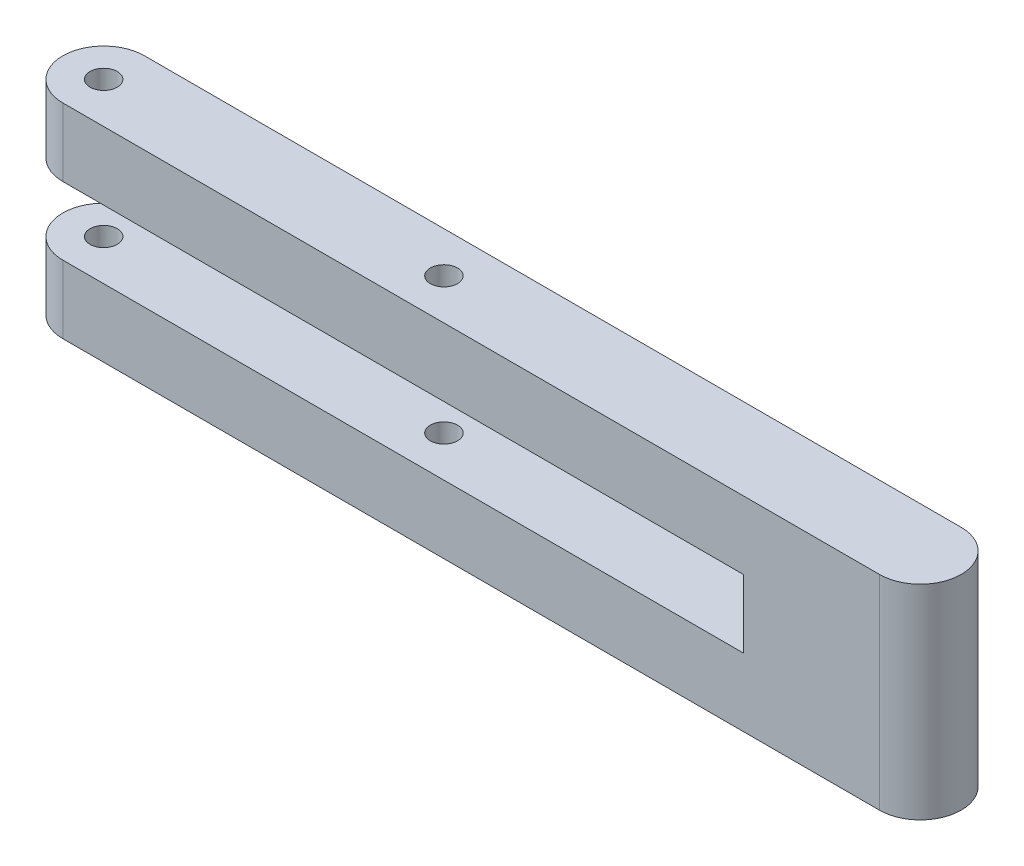
ISO-10303-21;
HEADER;
FILE_DESCRIPTION(('STEP AP214'),'2;1');
FILE_NAME('part.step','',(''),(''),'','','');
FILE_SCHEMA(('AUTOMOTIVE_DESIGN { 1 0 10303 214 1 1 1 1 }'));
ENDSEC;
DATA;
#1=APPLICATION_CONTEXT('core data for automotive mechanical design processes');
#2=APPLICATION_PROTOCOL_DEFINITION('international standard','automotive_design',2000,#1);
#3=PRODUCT_CONTEXT('',#1,'mechanical');
#4=PRODUCT('Part','Part','',(#3));
#5=PRODUCT_RELATED_PRODUCT_CATEGORY('part','',(#4));
#6=PRODUCT_DEFINITION_FORMATION('','',#4);
#7=PRODUCT_DEFINITION_CONTEXT('part definition',#1,'design');
#8=PRODUCT_DEFINITION('design','',#6,#7);
#9=PRODUCT_DEFINITION_SHAPE('','',#8);
#10=(LENGTH_UNIT() NAMED_UNIT(*) SI_UNIT(.MILLI.,.METRE.));
#11=(NAMED_UNIT(*) PLANE_ANGLE_UNIT() SI_UNIT($,.RADIAN.));
#12=(NAMED_UNIT(*) SI_UNIT($,.STERADIAN.) SOLID_ANGLE_UNIT());
#13=UNCERTAINTY_MEASURE_WITH_UNIT(LENGTH_MEASURE(1.E-05),#10,'distance_accuracy_value','');
#14=(GEOMETRIC_REPRESENTATION_CONTEXT(3) GLOBAL_UNCERTAINTY_ASSIGNED_CONTEXT((#13)) GLOBAL_UNIT_ASSIGNED_CONTEXT((#10,
#11,#12)) REPRESENTATION_CONTEXT('',''));
#15=CARTESIAN_POINT('',(0.,0.,0.));
#16=DIRECTION('',(0.,0.,1.));
#17=DIRECTION('',(1.,0.,0.));
#18=AXIS2_PLACEMENT_3D('',#15,#16,#17);
#19=CARTESIAN_POINT('',(-63.5,38.1,0.));
#20=DIRECTION('',(0.,-1.,0.));
#21=DIRECTION('',(0.,0.,-1.));
#22=AXIS2_PLACEMENT_3D('',#19,#20,#21);
#23=CYLINDRICAL_SURFACE('',#22,7.62);
#24=CARTESIAN_POINT('',(-63.5,12.7,0.));
#25=DIRECTION('',(0.,1.,0.));
#26=DIRECTION('',(0.,0.,1.));
#27=AXIS2_PLACEMENT_3D('',#24,#25,#26);
#28=CIRCLE('',#27,7.62);
#29=CARTESIAN_POINT('',(-63.5,12.7,-7.62));
#30=VERTEX_POINT('',#29);
#31=CARTESIAN_POINT('',(-63.5,12.7,7.62));
#32=VERTEX_POINT('',#31);
#33=EDGE_CURVE('E119',#30,#32,#28,.T.);
#34=ORIENTED_EDGE('',*,*,#33,.F.);
#35=DIRECTION('',(0.,-1.,0.));
#36=VECTOR('',#35,1.);
#37=CARTESIAN_POINT('',(-63.5,38.1,-7.62));
#38=LINE('',#37,#36);
#39=CARTESIAN_POINT('',(-63.5,0.,-7.62));
#40=VERTEX_POINT('',#39);
#41=EDGE_CURVE('E89',#30,#40,#38,.T.);
#42=ORIENTED_EDGE('',*,*,#41,.T.);
#43=CARTESIAN_POINT('',(-63.5,0.,0.));
#44=DIRECTION('',(0.,1.,0.));
#45=DIRECTION('',(0.,0.,1.));
#46=AXIS2_PLACEMENT_3D('',#43,#44,#45);
#47=CIRCLE('',#46,7.62);
#48=CARTESIAN_POINT('',(-63.5,0.,7.62));
#49=VERTEX_POINT('',#48);
#50=EDGE_CURVE('E166',#40,#49,#47,.T.);
#51=ORIENTED_EDGE('',*,*,#50,.T.);
#52=DIRECTION('',(0.,-1.,0.));
#53=VECTOR('',#52,1.);
#54=CARTESIAN_POINT('',(-63.5,38.1,7.62));
#55=LINE('',#54,#53);
#56=EDGE_CURVE('E50',#32,#49,#55,.T.);
#57=ORIENTED_EDGE('',*,*,#56,.F.);
#58=EDGE_LOOP('',(#34,#42,#51,#57));
#59=FACE_BOUND('',#58,.T.);
#60=ADVANCED_FACE('F41',(#59),#23,.T.);
#61=CARTESIAN_POINT('',(0.,0.,0.));
#62=DIRECTION('',(0.,1.,0.));
#63=DIRECTION('',(0.,0.,1.));
#64=AXIS2_PLACEMENT_3D('',#61,#62,#63);
#65=CYLINDRICAL_SURFACE('',#64,2.54);
#66=CARTESIAN_POINT('',(0.,0.,0.));
#67=DIRECTION('',(0.,1.,0.));
#68=DIRECTION('',(0.,0.,1.));
#69=AXIS2_PLACEMENT_3D('',#66,#67,#68);
#70=CIRCLE('',#69,2.54);
#71=CARTESIAN_POINT('',(0.,0.,2.54));
#72=VERTEX_POINT('',#71);
#73=EDGE_CURVE('E162',#72,#72,#70,.T.);
#74=CARTESIAN_POINT('',(0.,12.7,0.));
#75=DIRECTION('',(0.,1.,0.));
#76=DIRECTION('',(0.,0.,1.));
#77=AXIS2_PLACEMENT_3D('',#74,#75,#76);
#78=CIRCLE('',#77,2.54);
#79=CARTESIAN_POINT('',(0.,12.7,2.54));
#80=VERTEX_POINT('',#79);
#81=EDGE_CURVE('E146',#80,#80,#78,.F.);
#82=CARTESIAN_POINT('',(0.,0.,2.54));
#83=CARTESIAN_POINT('',(0.,0.132291666666667,2.54));
#84=CARTESIAN_POINT('',(0.,0.264583333333333,2.54));
#85=CARTESIAN_POINT('',(0.,0.529166666666667,2.54));
#86=CARTESIAN_POINT('',(0.,0.661458333333333,2.54));
#87=CARTESIAN_POINT('',(0.,0.926041666666667,2.54));
#88=CARTESIAN_POINT('',(0.,1.05833333333333,2.54));
#89=CARTESIAN_POINT('',(0.,1.32291666666667,2.54));
#90=CARTESIAN_POINT('',(0.,1.45520833333333,2.54));
#91=CARTESIAN_POINT('',(0.,1.71979166666667,2.54));
#92=CARTESIAN_POINT('',(0.,1.85208333333333,2.54));
#93=CARTESIAN_POINT('',(0.,2.11666666666667,2.54));
#94=CARTESIAN_POINT('',(0.,2.24895833333333,2.54));
#95=CARTESIAN_POINT('',(0.,2.51354166666667,2.54));
#96=CARTESIAN_POINT('',(0.,2.64583333333333,2.54));
#97=CARTESIAN_POINT('',(0.,2.91041666666667,2.54));
#98=CARTESIAN_POINT('',(0.,3.04270833333333,2.54));
#99=CARTESIAN_POINT('',(0.,3.30729166666667,2.54));
#100=CARTESIAN_POINT('',(0.,3.43958333333333,2.54));
#101=CARTESIAN_POINT('',(0.,3.70416666666667,2.54));
#102=CARTESIAN_POINT('',(0.,3.83645833333333,2.54));
#103=CARTESIAN_POINT('',(0.,4.10104166666667,2.54));
#104=CARTESIAN_POINT('',(0.,4.23333333333333,2.54));
#105=CARTESIAN_POINT('',(0.,4.49791666666667,2.54));
#106=CARTESIAN_POINT('',(0.,4.63020833333333,2.54));
#107=CARTESIAN_POINT('',(0.,4.89479166666667,2.54));
#108=CARTESIAN_POINT('',(0.,5.02708333333333,2.54));
#109=CARTESIAN_POINT('',(0.,5.29166666666667,2.54));
#110=CARTESIAN_POINT('',(0.,5.42395833333333,2.54));
#111=CARTESIAN_POINT('',(0.,5.68854166666667,2.54));
#112=CARTESIAN_POINT('',(0.,5.82083333333333,2.54));
#113=CARTESIAN_POINT('',(0.,6.08541666666667,2.54));
#114=CARTESIAN_POINT('',(0.,6.21770833333333,2.54));
#115=CARTESIAN_POINT('',(0.,6.48229166666667,2.54));
#116=CARTESIAN_POINT('',(0.,6.61458333333333,2.54));
#117=CARTESIAN_POINT('',(0.,6.87916666666667,2.54));
#118=CARTESIAN_POINT('',(0.,7.01145833333333,2.54));
#119=CARTESIAN_POINT('',(0.,7.27604166666667,2.54));
#120=CARTESIAN_POINT('',(0.,7.40833333333333,2.54));
#121=CARTESIAN_POINT('',(0.,7.67291666666667,2.54));
#122=CARTESIAN_POINT('',(0.,7.80520833333333,2.54));
#123=CARTESIAN_POINT('',(0.,8.06979166666667,2.54));
#124=CARTESIAN_POINT('',(0.,8.20208333333333,2.54));
#125=CARTESIAN_POINT('',(0.,8.46666666666667,2.54));
#126=CARTESIAN_POINT('',(0.,8.59895833333333,2.54));
#127=CARTESIAN_POINT('',(0.,8.86354166666667,2.54));
#128=CARTESIAN_POINT('',(0.,8.99583333333334,2.54));
#129=CARTESIAN_POINT('',(0.,9.26041666666667,2.54));
#130=CARTESIAN_POINT('',(0.,9.39270833333333,2.54));
#131=CARTESIAN_POINT('',(0.,9.65729166666667,2.54));
#132=CARTESIAN_POINT('',(0.,9.78958333333333,2.54));
#133=CARTESIAN_POINT('',(0.,10.0541666666667,2.54));
#134=CARTESIAN_POINT('',(0.,10.1864583333333,2.54));
#135=CARTESIAN_POINT('',(0.,10.4510416666667,2.54));
#136=CARTESIAN_POINT('',(0.,10.5833333333333,2.54));
#137=CARTESIAN_POINT('',(0.,10.8479166666667,2.54));
#138=CARTESIAN_POINT('',(0.,10.9802083333333,2.54));
#139=CARTESIAN_POINT('',(0.,11.2447916666667,2.54));
#140=CARTESIAN_POINT('',(0.,11.3770833333333,2.54));
#141=CARTESIAN_POINT('',(0.,11.6416666666667,2.54));
#142=CARTESIAN_POINT('',(0.,11.7739583333333,2.54));
#143=CARTESIAN_POINT('',(0.,12.0385416666667,2.54));
#144=CARTESIAN_POINT('',(0.,12.1708333333333,2.54));
#145=CARTESIAN_POINT('',(0.,12.4354166666667,2.54));
#146=CARTESIAN_POINT('',(0.,12.5677083333333,2.54));
#147=CARTESIAN_POINT('',(0.,12.7,2.54));
#148=B_SPLINE_CURVE_WITH_KNOTS('',3,(#82,#83,#84,#85,#86,#87,#88,#89,#90,#91,#92,#93,#94,#95,
#96,#97,#98,#99,#100,#101,#102,#103,#104,#105,#106,#107,#108,#109,#110,#111,#112,#113,#114,#115,
#116,#117,#118,#119,#120,#121,#122,#123,#124,#125,#126,#127,#128,#129,#130,#131,#132,#133,#134,
#135,#136,#137,#138,#139,#140,#141,#142,#143,#144,#145,#146,#147),.UNSPECIFIED.,.F.,.F.,(4,2,2,
2,2,2,2,2,2,2,2,2,2,2,2,2,2,2,2,2,2,2,2,2,2,2,2,2,2,2,2,2,4),(0.,0.396875,0.79375,1.190625,
1.5875,1.984375,2.38125,2.778125,3.175,3.571875,3.96875,4.365625,4.7625,5.159375,5.55625,
5.953125,6.35,6.746875,7.14375,7.540625,7.9375,8.334375,8.73125,9.128125,9.525,9.921875,
10.31875,10.715625,11.1125,11.509375,11.90625,12.303125,12.7),.UNSPECIFIED.);
#149=EDGE_CURVE('BSEAM220',#72,#80,#148,.T.);
#150=ORIENTED_EDGE('',*,*,#73,.F.);
#151=ORIENTED_EDGE('',*,*,#81,.F.);
#152=ORIENTED_EDGE('',*,*,#149,.T.);
#153=ORIENTED_EDGE('',*,*,#149,.F.);
#154=EDGE_LOOP('',(#150,#152,#151,#153));
#155=FACE_BOUND('',#154,.T.);
#156=ADVANCED_FACE('F220',(#155),#65,.F.);
#157=CARTESIAN_POINT('',(-63.5,0.,0.));
#158=DIRECTION('',(0.,1.,0.));
#159=DIRECTION('',(0.,0.,1.));
#160=AXIS2_PLACEMENT_3D('',#157,#158,#159);
#161=CYLINDRICAL_SURFACE('',#160,2.54);
#162=CARTESIAN_POINT('',(-63.5,0.,0.));
#163=DIRECTION('',(0.,1.,0.));
#164=DIRECTION('',(0.,0.,1.));
#165=AXIS2_PLACEMENT_3D('',#162,#163,#164);
#166=CIRCLE('',#165,2.54);
#167=CARTESIAN_POINT('',(-63.5,0.,2.54));
#168=VERTEX_POINT('',#167);
#169=EDGE_CURVE('E163',#168,#168,#166,.T.);
#170=CARTESIAN_POINT('',(-63.5,12.7,0.));
#171=DIRECTION('',(0.,1.,0.));
#172=DIRECTION('',(0.,0.,1.));
#173=AXIS2_PLACEMENT_3D('',#170,#171,#172);
#174=CIRCLE('',#173,2.54);
#175=CARTESIAN_POINT('',(-63.5,12.7,2.54));
#176=VERTEX_POINT('',#175);
#177=EDGE_CURVE('E144',#176,#176,#174,.F.);
#178=CARTESIAN_POINT('',(-63.5,0.,2.54));
#179=CARTESIAN_POINT('',(-63.5,0.132291666666667,2.54));
#180=CARTESIAN_POINT('',(-63.5,0.264583333333333,2.54));
#181=CARTESIAN_POINT('',(-63.5,0.529166666666667,2.54));
#182=CARTESIAN_POINT('',(-63.5,0.661458333333333,2.54));
#183=CARTESIAN_POINT('',(-63.5,0.926041666666667,2.54));
#184=CARTESIAN_POINT('',(-63.5,1.05833333333333,2.54));
#185=CARTESIAN_POINT('',(-63.5,1.32291666666667,2.54));
#186=CARTESIAN_POINT('',(-63.5,1.45520833333333,2.54));
#187=CARTESIAN_POINT('',(-63.5,1.71979166666667,2.54));
#188=CARTESIAN_POINT('',(-63.5,1.85208333333333,2.54));
#189=CARTESIAN_POINT('',(-63.5,2.11666666666667,2.54));
#190=CARTESIAN_POINT('',(-63.5,2.24895833333333,2.54));
#191=CARTESIAN_POINT('',(-63.5,2.51354166666667,2.54));
#192=CARTESIAN_POINT('',(-63.5,2.64583333333333,2.54));
#193=CARTESIAN_POINT('',(-63.5,2.91041666666667,2.54));
#194=CARTESIAN_POINT('',(-63.5,3.04270833333333,2.54));
#195=CARTESIAN_POINT('',(-63.5,3.30729166666667,2.54));
#196=CARTESIAN_POINT('',(-63.5,3.43958333333333,2.54));
#197=CARTESIAN_POINT('',(-63.5,3.70416666666667,2.54));
#198=CARTESIAN_POINT('',(-63.5,3.83645833333333,2.54));
#199=CARTESIAN_POINT('',(-63.5,4.10104166666667,2.54));
#200=CARTESIAN_POINT('',(-63.5,4.23333333333333,2.54));
#201=CARTESIAN_POINT('',(-63.5,4.49791666666667,2.54));
#202=CARTESIAN_POINT('',(-63.5,4.63020833333333,2.54));
#203=CARTESIAN_POINT('',(-63.5,4.89479166666667,2.54));
#204=CARTESIAN_POINT('',(-63.5,5.02708333333333,2.54));
#205=CARTESIAN_POINT('',(-63.5,5.29166666666667,2.54));
#206=CARTESIAN_POINT('',(-63.5,5.42395833333333,2.54));
#207=CARTESIAN_POINT('',(-63.5,5.68854166666667,2.54));
#208=CARTESIAN_POINT('',(-63.5,5.82083333333333,2.54));
#209=CARTESIAN_POINT('',(-63.5,6.08541666666667,2.54));
#210=CARTESIAN_POINT('',(-63.5,6.21770833333333,2.54));
#211=CARTESIAN_POINT('',(-63.5,6.48229166666667,2.54));
#212=CARTESIAN_POINT('',(-63.5,6.61458333333333,2.54));
#213=CARTESIAN_POINT('',(-63.5,6.87916666666667,2.54));
#214=CARTESIAN_POINT('',(-63.5,7.01145833333333,2.54));
#215=CARTESIAN_POINT('',(-63.5,7.27604166666667,2.54));
#216=CARTESIAN_POINT('',(-63.5,7.40833333333333,2.54));
#217=CARTESIAN_POINT('',(-63.5,7.67291666666667,2.54));
#218=CARTESIAN_POINT('',(-63.5,7.80520833333333,2.54));
#219=CARTESIAN_POINT('',(-63.5,8.06979166666667,2.54));
#220=CARTESIAN_POINT('',(-63.5,8.20208333333333,2.54));
#221=CARTESIAN_POINT('',(-63.5,8.46666666666667,2.54));
#222=CARTESIAN_POINT('',(-63.5,8.59895833333333,2.54));
#223=CARTESIAN_POINT('',(-63.5,8.86354166666667,2.54));
#224=CARTESIAN_POINT('',(-63.5,8.99583333333334,2.54));
#225=CARTESIAN_POINT('',(-63.5,9.26041666666667,2.54));
#226=CARTESIAN_POINT('',(-63.5,9.39270833333333,2.54));
#227=CARTESIAN_POINT('',(-63.5,9.65729166666667,2.54));
#228=CARTESIAN_POINT('',(-63.5,9.78958333333333,2.54));
#229=CARTESIAN_POINT('',(-63.5,10.0541666666667,2.54));
#230=CARTESIAN_POINT('',(-63.5,10.1864583333333,2.54));
#231=CARTESIAN_POINT('',(-63.5,10.4510416666667,2.54));
#232=CARTESIAN_POINT('',(-63.5,10.5833333333333,2.54));
#233=CARTESIAN_POINT('',(-63.5,10.8479166666667,2.54));
#234=CARTESIAN_POINT('',(-63.5,10.9802083333333,2.54));
#235=CARTESIAN_POINT('',(-63.5,11.2447916666667,2.54));
#236=CARTESIAN_POINT('',(-63.5,11.3770833333333,2.54));
#237=CARTESIAN_POINT('',(-63.5,11.6416666666667,2.54));
#238=CARTESIAN_POINT('',(-63.5,11.7739583333333,2.54));
#239=CARTESIAN_POINT('',(-63.5,12.0385416666667,2.54));
#240=CARTESIAN_POINT('',(-63.5,12.1708333333333,2.54));
#241=CARTESIAN_POINT('',(-63.5,12.4354166666667,2.54));
#242=CARTESIAN_POINT('',(-63.5,12.5677083333333,2.54));
#243=CARTESIAN_POINT('',(-63.5,12.7,2.54));
#244=B_SPLINE_CURVE_WITH_KNOTS('',3,(#178,#179,#180,#181,#182,#183,#184,#185,#186,#187,#188,
#189,#190,#191,#192,#193,#194,#195,#196,#197,#198,#199,#200,#201,#202,#203,#204,#205,#206,#207,
#208,#209,#210,#211,#212,#213,#214,#215,#216,#217,#218,#219,#220,#221,#222,#223,#224,#225,#226,
#227,#228,#229,#230,#231,#232,#233,#234,#235,#236,#237,#238,#239,#240,#241,#242,#243),
.UNSPECIFIED.,.F.,.F.,(4,2,2,2,2,2,2,2,2,2,2,2,2,2,2,2,2,2,2,2,2,2,2,2,2,2,2,2,2,2,2,2,4),(0.,
0.396875,0.79375,1.190625,1.5875,1.984375,2.38125,2.778125,3.175,3.571875,3.96875,4.365625,
4.7625,5.159375,5.55625,5.953125,6.35,6.746875,7.14375,7.540625,7.9375,8.334375,8.73125,
9.128125,9.525,9.921875,10.31875,10.715625,11.1125,11.509375,11.90625,12.303125,12.7),.UNSPECIFIED.);
#245=EDGE_CURVE('BSEAM225',#168,#176,#244,.T.);
#246=ORIENTED_EDGE('',*,*,#169,.F.);
#247=ORIENTED_EDGE('',*,*,#177,.F.);
#248=ORIENTED_EDGE('',*,*,#245,.T.);
#249=ORIENTED_EDGE('',*,*,#245,.F.);
#250=EDGE_LOOP('',(#246,#248,#247,#249));
#251=FACE_BOUND('',#250,.T.);
#252=ADVANCED_FACE('F225',(#251),#161,.F.);
#253=CARTESIAN_POINT('',(-63.5,38.1,-7.62));
#254=VERTEX_POINT('',#253);
#255=CARTESIAN_POINT('',(-63.5,25.4,-7.62));
#256=VERTEX_POINT('',#255);
#257=EDGE_CURVE('E132',#254,#256,#38,.T.);
#258=ORIENTED_EDGE('',*,*,#257,.T.);
#259=CARTESIAN_POINT('',(-63.5,25.4,0.));
#260=DIRECTION('',(0.,1.,0.));
#261=DIRECTION('',(0.,0.,1.));
#262=AXIS2_PLACEMENT_3D('',#259,#260,#261);
#263=CIRCLE('',#262,7.62);
#264=CARTESIAN_POINT('',(-63.5,25.4,7.62));
#265=VERTEX_POINT('',#264);
#266=EDGE_CURVE('E196',#256,#265,#263,.T.);
#267=ORIENTED_EDGE('',*,*,#266,.T.);
#268=CARTESIAN_POINT('',(-63.5,38.1,7.62));
#269=VERTEX_POINT('',#268);
#270=EDGE_CURVE('E11',#269,#265,#55,.T.);
#271=ORIENTED_EDGE('',*,*,#270,.F.);
#272=CARTESIAN_POINT('',(-63.5,38.1,0.));
#273=DIRECTION('',(0.,1.,0.));
#274=DIRECTION('',(0.,0.,1.));
#275=AXIS2_PLACEMENT_3D('',#272,#273,#274);
#276=CIRCLE('',#275,7.62);
#277=EDGE_CURVE('E175',#254,#269,#276,.T.);
#278=ORIENTED_EDGE('',*,*,#277,.F.);
#279=EDGE_LOOP('',(#258,#267,#271,#278));
#280=FACE_BOUND('',#279,.T.);
#281=ADVANCED_FACE('F43',(#280),#23,.T.);
#282=CARTESIAN_POINT('',(-63.5,38.1,7.62));
#283=DIRECTION('',(0.,0.,-1.));
#284=DIRECTION('',(-1.,0.,0.));
#285=AXIS2_PLACEMENT_3D('',#282,#283,#284);
#286=PLANE('',#285);
#287=ORIENTED_EDGE('',*,*,#270,.T.);
#288=DIRECTION('',(1.,0.,0.));
#289=VECTOR('',#288,1.);
#290=CARTESIAN_POINT('',(0.,25.4,7.62));
#291=LINE('',#290,#289);
#292=CARTESIAN_POINT('',(63.5,25.4,7.62));
#293=VERTEX_POINT('',#292);
#294=EDGE_CURVE('E199',#265,#293,#291,.T.);
#295=ORIENTED_EDGE('',*,*,#294,.T.);
#296=DIRECTION('',(0.,-1.,0.));
#297=VECTOR('',#296,1.);
#298=CARTESIAN_POINT('',(63.5,25.4,7.62));
#299=LINE('',#298,#297);
#300=CARTESIAN_POINT('',(63.5,12.7,7.62));
#301=VERTEX_POINT('',#300);
#302=EDGE_CURVE('E147',#293,#301,#299,.T.);
#303=ORIENTED_EDGE('',*,*,#302,.T.);
#304=DIRECTION('',(1.,0.,0.));
#305=VECTOR('',#304,1.);
#306=CARTESIAN_POINT('',(0.,12.7,7.62));
#307=LINE('',#306,#305);
#308=EDGE_CURVE('E125',#32,#301,#307,.T.);
#309=ORIENTED_EDGE('',*,*,#308,.F.);
#310=ORIENTED_EDGE('',*,*,#56,.T.);
#311=DIRECTION('',(1.,0.,0.));
#312=VECTOR('',#311,1.);
#313=CARTESIAN_POINT('',(-63.5,0.,7.62));
#314=LINE('',#313,#312);
#315=CARTESIAN_POINT('',(88.9,0.,7.62));
#316=VERTEX_POINT('',#315);
#317=EDGE_CURVE('E180',#49,#316,#314,.T.);
#318=ORIENTED_EDGE('',*,*,#317,.T.);
#319=DIRECTION('',(0.,-1.,0.));
#320=VECTOR('',#319,1.);
#321=CARTESIAN_POINT('',(88.9,38.1,7.62));
#322=LINE('',#321,#320);
#323=CARTESIAN_POINT('',(88.9,38.1,7.62));
#324=VERTEX_POINT('',#323);
#325=EDGE_CURVE('E142',#324,#316,#322,.T.);
#326=ORIENTED_EDGE('',*,*,#325,.F.);
#327=DIRECTION('',(1.,0.,0.));
#328=VECTOR('',#327,1.);
#329=CARTESIAN_POINT('',(-63.5,38.1,7.62));
#330=LINE('',#329,#328);
#331=EDGE_CURVE('E96',#269,#324,#330,.T.);
#332=ORIENTED_EDGE('',*,*,#331,.F.);
#333=EDGE_LOOP('',(#287,#295,#303,#309,#310,#318,#326,#332));
#334=FACE_BOUND('',#333,.T.);
#335=ADVANCED_FACE('F190',(#334),#286,.F.);
#336=CARTESIAN_POINT('',(88.9,38.1,0.));
#337=DIRECTION('',(0.,-1.,0.));
#338=DIRECTION('',(0.,0.,-1.));
#339=AXIS2_PLACEMENT_3D('',#336,#337,#338);
#340=CYLINDRICAL_SURFACE('',#339,7.62);
#341=CARTESIAN_POINT('',(88.9,0.,0.));
#342=DIRECTION('',(0.,1.,0.));
#343=DIRECTION('',(0.,0.,1.));
#344=AXIS2_PLACEMENT_3D('',#341,#342,#343);
#345=CIRCLE('',#344,7.62);
#346=CARTESIAN_POINT('',(88.9,0.,-7.62));
#347=VERTEX_POINT('',#346);
#348=EDGE_CURVE('E181',#316,#347,#345,.T.);
#349=ORIENTED_EDGE('',*,*,#348,.T.);
#350=DIRECTION('',(0.,-1.,0.));
#351=VECTOR('',#350,1.);
#352=CARTESIAN_POINT('',(88.9,38.1,-7.62));
#353=LINE('',#352,#351);
#354=CARTESIAN_POINT('',(88.9,38.1,-7.62));
#355=VERTEX_POINT('',#354);
#356=EDGE_CURVE('E135',#355,#347,#353,.T.);
#357=ORIENTED_EDGE('',*,*,#356,.F.);
#358=CARTESIAN_POINT('',(88.9,38.1,0.));
#359=DIRECTION('',(0.,1.,0.));
#360=DIRECTION('',(0.,0.,1.));
#361=AXIS2_PLACEMENT_3D('',#358,#359,#360);
#362=CIRCLE('',#361,7.62);
#363=EDGE_CURVE('E136',#324,#355,#362,.T.);
#364=ORIENTED_EDGE('',*,*,#363,.F.);
#365=ORIENTED_EDGE('',*,*,#325,.T.);
#366=EDGE_LOOP('',(#349,#357,#364,#365));
#367=FACE_BOUND('',#366,.T.);
#368=ADVANCED_FACE('F185',(#367),#340,.T.);
#369=CARTESIAN_POINT('',(-63.5,38.1,-7.62));
#370=DIRECTION('',(0.,0.,1.));
#371=DIRECTION('',(1.,0.,0.));
#372=AXIS2_PLACEMENT_3D('',#369,#370,#371);
#373=PLANE('',#372);
#374=DIRECTION('',(0.,-1.,0.));
#375=VECTOR('',#374,1.);
#376=CARTESIAN_POINT('',(63.5,25.4,-7.62));
#377=LINE('',#376,#375);
#378=CARTESIAN_POINT('',(63.5,25.4,-7.62));
#379=VERTEX_POINT('',#378);
#380=CARTESIAN_POINT('',(63.5,12.7,-7.62));
#381=VERTEX_POINT('',#380);
#382=EDGE_CURVE('E152',#379,#381,#377,.T.);
#383=ORIENTED_EDGE('',*,*,#382,.F.);
#384=DIRECTION('',(1.,0.,0.));
#385=VECTOR('',#384,1.);
#386=CARTESIAN_POINT('',(0.,25.4,-7.62));
#387=LINE('',#386,#385);
#388=EDGE_CURVE('E192',#256,#379,#387,.T.);
#389=ORIENTED_EDGE('',*,*,#388,.F.);
#390=ORIENTED_EDGE('',*,*,#257,.F.);
#391=DIRECTION('',(-1.,0.,0.));
#392=VECTOR('',#391,1.);
#393=CARTESIAN_POINT('',(-63.5,38.1,-7.62));
#394=LINE('',#393,#392);
#395=EDGE_CURVE('E67',#355,#254,#394,.T.);
#396=ORIENTED_EDGE('',*,*,#395,.F.);
#397=ORIENTED_EDGE('',*,*,#356,.T.);
#398=DIRECTION('',(-1.,0.,0.));
#399=VECTOR('',#398,1.);
#400=CARTESIAN_POINT('',(-63.5,0.,-7.62));
#401=LINE('',#400,#399);
#402=EDGE_CURVE('E130',#347,#40,#401,.T.);
#403=ORIENTED_EDGE('',*,*,#402,.T.);
#404=ORIENTED_EDGE('',*,*,#41,.F.);
#405=DIRECTION('',(1.,0.,0.));
#406=VECTOR('',#405,1.);
#407=CARTESIAN_POINT('',(0.,12.7,-7.62));
#408=LINE('',#407,#406);
#409=EDGE_CURVE('E116',#30,#381,#408,.T.);
#410=ORIENTED_EDGE('',*,*,#409,.T.);
#411=EDGE_LOOP('',(#383,#389,#390,#396,#397,#403,#404,#410));
#412=FACE_BOUND('',#411,.T.);
#413=ADVANCED_FACE('F127',(#412),#373,.F.);
#414=CARTESIAN_POINT('',(-63.5,38.1,0.));
#415=DIRECTION('',(0.,1.,0.));
#416=DIRECTION('',(0.,0.,1.));
#417=AXIS2_PLACEMENT_3D('',#414,#415,#416);
#418=PLANE('',#417);
#419=CARTESIAN_POINT('',(-63.5,38.1,0.));
#420=DIRECTION('',(0.,1.,0.));
#421=DIRECTION('',(0.,0.,1.));
#422=AXIS2_PLACEMENT_3D('',#419,#420,#421);
#423=CIRCLE('',#422,2.54);
#424=CARTESIAN_POINT('',(-63.5,38.1,2.54));
#425=VERTEX_POINT('',#424);
#426=EDGE_CURVE('E167',#425,#425,#423,.T.);
#427=ORIENTED_EDGE('',*,*,#426,.F.);
#428=EDGE_LOOP('',(#427));
#429=FACE_BOUND('',#428,.T.);
#430=CARTESIAN_POINT('',(0.,38.1,0.));
#431=DIRECTION('',(0.,1.,0.));
#432=DIRECTION('',(0.,0.,1.));
#433=AXIS2_PLACEMENT_3D('',#430,#431,#432);
#434=CIRCLE('',#433,2.54);
#435=CARTESIAN_POINT('',(0.,38.1,2.54));
#436=VERTEX_POINT('',#435);
#437=EDGE_CURVE('E170',#436,#436,#434,.T.);
#438=ORIENTED_EDGE('',*,*,#437,.F.);
#439=EDGE_LOOP('',(#438));
#440=FACE_BOUND('',#439,.T.);
#441=ORIENTED_EDGE('',*,*,#277,.T.);
#442=ORIENTED_EDGE('',*,*,#331,.T.);
#443=ORIENTED_EDGE('',*,*,#363,.T.);
#444=ORIENTED_EDGE('',*,*,#395,.T.);
#445=EDGE_LOOP('',(#441,#442,#443,#444));
#446=FACE_BOUND('',#445,.T.);
#447=ADVANCED_FACE('F253',(#429,#440,#446),#418,.T.);
#448=CARTESIAN_POINT('',(-63.5,0.,0.));
#449=DIRECTION('',(0.,1.,0.));
#450=DIRECTION('',(0.,0.,1.));
#451=AXIS2_PLACEMENT_3D('',#448,#449,#450);
#452=PLANE('',#451);
#453=ORIENTED_EDGE('',*,*,#169,.T.);
#454=EDGE_LOOP('',(#453));
#455=FACE_BOUND('',#454,.T.);
#456=ORIENTED_EDGE('',*,*,#73,.T.);
#457=EDGE_LOOP('',(#456));
#458=FACE_BOUND('',#457,.T.);
#459=ORIENTED_EDGE('',*,*,#50,.F.);
#460=ORIENTED_EDGE('',*,*,#402,.F.);
#461=ORIENTED_EDGE('',*,*,#348,.F.);
#462=ORIENTED_EDGE('',*,*,#317,.F.);
#463=EDGE_LOOP('',(#459,#460,#461,#462));
#464=FACE_BOUND('',#463,.T.);
#465=ADVANCED_FACE('F189',(#455,#458,#464),#452,.F.);
#466=CARTESIAN_POINT('',(0.,25.4,0.));
#467=DIRECTION('',(0.,1.,0.));
#468=DIRECTION('',(0.,0.,1.));
#469=AXIS2_PLACEMENT_3D('',#466,#467,#468);
#470=CIRCLE('',#469,2.54);
#471=CARTESIAN_POINT('',(0.,25.4,2.54));
#472=VERTEX_POINT('',#471);
#473=EDGE_CURVE('E159',#472,#472,#470,.F.);
#474=CARTESIAN_POINT('',(0.,25.4,2.54));
#475=CARTESIAN_POINT('',(0.,25.5322916666667,2.54));
#476=CARTESIAN_POINT('',(0.,25.6645833333333,2.54));
#477=CARTESIAN_POINT('',(0.,25.9291666666667,2.54));
#478=CARTESIAN_POINT('',(0.,26.0614583333333,2.54));
#479=CARTESIAN_POINT('',(0.,26.3260416666667,2.54));
#480=CARTESIAN_POINT('',(0.,26.4583333333333,2.54));
#481=CARTESIAN_POINT('',(0.,26.7229166666667,2.54));
#482=CARTESIAN_POINT('',(0.,26.8552083333333,2.54));
#483=CARTESIAN_POINT('',(0.,27.1197916666667,2.54));
#484=CARTESIAN_POINT('',(0.,27.2520833333333,2.54));
#485=CARTESIAN_POINT('',(0.,27.5166666666667,2.54));
#486=CARTESIAN_POINT('',(0.,27.6489583333333,2.54));
#487=CARTESIAN_POINT('',(0.,27.9135416666667,2.54));
#488=CARTESIAN_POINT('',(0.,28.0458333333333,2.54));
#489=CARTESIAN_POINT('',(0.,28.3104166666667,2.54));
#490=CARTESIAN_POINT('',(0.,28.4427083333333,2.54));
#491=CARTESIAN_POINT('',(0.,28.7072916666667,2.54));
#492=CARTESIAN_POINT('',(0.,28.8395833333333,2.54));
#493=CARTESIAN_POINT('',(0.,29.1041666666667,2.54));
#494=CARTESIAN_POINT('',(0.,29.2364583333333,2.54));
#495=CARTESIAN_POINT('',(0.,29.5010416666667,2.54));
#496=CARTESIAN_POINT('',(0.,29.6333333333333,2.54));
#497=CARTESIAN_POINT('',(0.,29.8979166666667,2.54));
#498=CARTESIAN_POINT('',(0.,30.0302083333333,2.54));
#499=CARTESIAN_POINT('',(0.,30.2947916666667,2.54));
#500=CARTESIAN_POINT('',(0.,30.4270833333333,2.54));
#501=CARTESIAN_POINT('',(0.,30.6916666666667,2.54));
#502=CARTESIAN_POINT('',(0.,30.8239583333333,2.54));
#503=CARTESIAN_POINT('',(0.,31.0885416666667,2.54));
#504=CARTESIAN_POINT('',(0.,31.2208333333333,2.54));
#505=CARTESIAN_POINT('',(0.,31.4854166666667,2.54));
#506=CARTESIAN_POINT('',(0.,31.6177083333333,2.54));
#507=CARTESIAN_POINT('',(0.,31.8822916666667,2.54));
#508=CARTESIAN_POINT('',(0.,32.0145833333333,2.54));
#509=CARTESIAN_POINT('',(0.,32.2791666666667,2.54));
#510=CARTESIAN_POINT('',(0.,32.4114583333333,2.54));
#511=CARTESIAN_POINT('',(0.,32.6760416666667,2.54));
#512=CARTESIAN_POINT('',(0.,32.8083333333333,2.54));
#513=CARTESIAN_POINT('',(0.,33.0729166666667,2.54));
#514=CARTESIAN_POINT('',(0.,33.2052083333333,2.54));
#515=CARTESIAN_POINT('',(0.,33.4697916666667,2.54));
#516=CARTESIAN_POINT('',(0.,33.6020833333333,2.54));
#517=CARTESIAN_POINT('',(0.,33.8666666666667,2.54));
#518=CARTESIAN_POINT('',(0.,33.9989583333333,2.54));
#519=CARTESIAN_POINT('',(0.,34.2635416666667,2.54));
#520=CARTESIAN_POINT('',(0.,34.3958333333333,2.54));
#521=CARTESIAN_POINT('',(0.,34.6604166666667,2.54));
#522=CARTESIAN_POINT('',(0.,34.7927083333333,2.54));
#523=CARTESIAN_POINT('',(0.,35.0572916666667,2.54));
#524=CARTESIAN_POINT('',(0.,35.1895833333333,2.54));
#525=CARTESIAN_POINT('',(0.,35.4541666666667,2.54));
#526=CARTESIAN_POINT('',(0.,35.5864583333333,2.54));
#527=CARTESIAN_POINT('',(0.,35.8510416666667,2.54));
#528=CARTESIAN_POINT('',(0.,35.9833333333333,2.54));
#529=CARTESIAN_POINT('',(0.,36.2479166666667,2.54));
#530=CARTESIAN_POINT('',(0.,36.3802083333333,2.54));
#531=CARTESIAN_POINT('',(0.,36.6447916666667,2.54));
#532=CARTESIAN_POINT('',(0.,36.7770833333333,2.54));
#533=CARTESIAN_POINT('',(0.,37.0416666666667,2.54));
#534=CARTESIAN_POINT('',(0.,37.1739583333333,2.54));
#535=CARTESIAN_POINT('',(0.,37.4385416666667,2.54));
#536=CARTESIAN_POINT('',(0.,37.5708333333333,2.54));
#537=CARTESIAN_POINT('',(0.,37.8354166666667,2.54));
#538=CARTESIAN_POINT('',(0.,37.9677083333333,2.54));
#539=CARTESIAN_POINT('',(0.,38.1,2.54));
#540=B_SPLINE_CURVE_WITH_KNOTS('',3,(#474,#475,#476,#477,#478,#479,#480,#481,#482,#483,#484,
#485,#486,#487,#488,#489,#490,#491,#492,#493,#494,#495,#496,#497,#498,#499,#500,#501,#502,#503,
#504,#505,#506,#507,#508,#509,#510,#511,#512,#513,#514,#515,#516,#517,#518,#519,#520,#521,#522,
#523,#524,#525,#526,#527,#528,#529,#530,#531,#532,#533,#534,#535,#536,#537,#538,#539),
.UNSPECIFIED.,.F.,.F.,(4,2,2,2,2,2,2,2,2,2,2,2,2,2,2,2,2,2,2,2,2,2,2,2,2,2,2,2,2,2,2,2,4),(0.,
0.396875000000001,0.793749999999999,1.190625,1.5875,1.984375,2.38125,2.778125,3.175,3.571875,
3.96875,4.365625,4.7625,5.159375,5.55625000000001,5.953125,6.35,6.746875,7.14375,7.540625,
7.9375,8.334375,8.73125,9.128125,9.525,9.921875,10.31875,10.715625,11.1125,11.509375,11.90625,
12.303125,12.7),.UNSPECIFIED.);
#541=EDGE_CURVE('BSEAM228',#472,#436,#540,.T.);
#542=ORIENTED_EDGE('',*,*,#473,.T.);
#543=ORIENTED_EDGE('',*,*,#437,.T.);
#544=ORIENTED_EDGE('',*,*,#541,.T.);
#545=ORIENTED_EDGE('',*,*,#541,.F.);
#546=EDGE_LOOP('',(#542,#544,#543,#545));
#547=FACE_BOUND('',#546,.T.);
#548=ADVANCED_FACE('F228',(#547),#65,.F.);
#549=CARTESIAN_POINT('',(-63.5,25.4,0.));
#550=DIRECTION('',(0.,1.,0.));
#551=DIRECTION('',(0.,0.,1.));
#552=AXIS2_PLACEMENT_3D('',#549,#550,#551);
#553=CIRCLE('',#552,2.54);
#554=CARTESIAN_POINT('',(-63.5,25.4,2.54));
#555=VERTEX_POINT('',#554);
#556=EDGE_CURVE('E45',#555,#555,#553,.F.);
#557=CARTESIAN_POINT('',(-63.5,25.4,2.54));
#558=CARTESIAN_POINT('',(-63.5,25.5322916666667,2.54));
#559=CARTESIAN_POINT('',(-63.5,25.6645833333333,2.54));
#560=CARTESIAN_POINT('',(-63.5,25.9291666666667,2.54));
#561=CARTESIAN_POINT('',(-63.5,26.0614583333333,2.54));
#562=CARTESIAN_POINT('',(-63.5,26.3260416666667,2.54));
#563=CARTESIAN_POINT('',(-63.5,26.4583333333333,2.54));
#564=CARTESIAN_POINT('',(-63.5,26.7229166666667,2.54));
#565=CARTESIAN_POINT('',(-63.5,26.8552083333333,2.54));
#566=CARTESIAN_POINT('',(-63.5,27.1197916666667,2.54));
#567=CARTESIAN_POINT('',(-63.5,27.2520833333333,2.54));
#568=CARTESIAN_POINT('',(-63.5,27.5166666666667,2.54));
#569=CARTESIAN_POINT('',(-63.5,27.6489583333333,2.54));
#570=CARTESIAN_POINT('',(-63.5,27.9135416666667,2.54));
#571=CARTESIAN_POINT('',(-63.5,28.0458333333333,2.54));
#572=CARTESIAN_POINT('',(-63.5,28.3104166666667,2.54));
#573=CARTESIAN_POINT('',(-63.5,28.4427083333333,2.54));
#574=CARTESIAN_POINT('',(-63.5,28.7072916666667,2.54));
#575=CARTESIAN_POINT('',(-63.5,28.8395833333333,2.54));
#576=CARTESIAN_POINT('',(-63.5,29.1041666666667,2.54));
#577=CARTESIAN_POINT('',(-63.5,29.2364583333333,2.54));
#578=CARTESIAN_POINT('',(-63.5,29.5010416666667,2.54));
#579=CARTESIAN_POINT('',(-63.5,29.6333333333333,2.54));
#580=CARTESIAN_POINT('',(-63.5,29.8979166666667,2.54));
#581=CARTESIAN_POINT('',(-63.5,30.0302083333333,2.54));
#582=CARTESIAN_POINT('',(-63.5,30.2947916666667,2.54));
#583=CARTESIAN_POINT('',(-63.5,30.4270833333333,2.54));
#584=CARTESIAN_POINT('',(-63.5,30.6916666666667,2.54));
#585=CARTESIAN_POINT('',(-63.5,30.8239583333333,2.54));
#586=CARTESIAN_POINT('',(-63.5,31.0885416666667,2.54));
#587=CARTESIAN_POINT('',(-63.5,31.2208333333333,2.54));
#588=CARTESIAN_POINT('',(-63.5,31.4854166666667,2.54));
#589=CARTESIAN_POINT('',(-63.5,31.6177083333333,2.54));
#590=CARTESIAN_POINT('',(-63.5,31.8822916666667,2.54));
#591=CARTESIAN_POINT('',(-63.5,32.0145833333333,2.54));
#592=CARTESIAN_POINT('',(-63.5,32.2791666666667,2.54));
#593=CARTESIAN_POINT('',(-63.5,32.4114583333333,2.54));
#594=CARTESIAN_POINT('',(-63.5,32.6760416666667,2.54));
#595=CARTESIAN_POINT('',(-63.5,32.8083333333333,2.54));
#596=CARTESIAN_POINT('',(-63.5,33.0729166666667,2.54));
#597=CARTESIAN_POINT('',(-63.5,33.2052083333333,2.54));
#598=CARTESIAN_POINT('',(-63.5,33.4697916666667,2.54));
#599=CARTESIAN_POINT('',(-63.5,33.6020833333333,2.54));
#600=CARTESIAN_POINT('',(-63.5,33.8666666666667,2.54));
#601=CARTESIAN_POINT('',(-63.5,33.9989583333333,2.54));
#602=CARTESIAN_POINT('',(-63.5,34.2635416666667,2.54));
#603=CARTESIAN_POINT('',(-63.5,34.3958333333333,2.54));
#604=CARTESIAN_POINT('',(-63.5,34.6604166666667,2.54));
#605=CARTESIAN_POINT('',(-63.5,34.7927083333333,2.54));
#606=CARTESIAN_POINT('',(-63.5,35.0572916666667,2.54));
#607=CARTESIAN_POINT('',(-63.5,35.1895833333333,2.54));
#608=CARTESIAN_POINT('',(-63.5,35.4541666666667,2.54));
#609=CARTESIAN_POINT('',(-63.5,35.5864583333333,2.54));
#610=CARTESIAN_POINT('',(-63.5,35.8510416666667,2.54));
#611=CARTESIAN_POINT('',(-63.5,35.9833333333333,2.54));
#612=CARTESIAN_POINT('',(-63.5,36.2479166666667,2.54));
#613=CARTESIAN_POINT('',(-63.5,36.3802083333333,2.54));
#614=CARTESIAN_POINT('',(-63.5,36.6447916666667,2.54));
#615=CARTESIAN_POINT('',(-63.5,36.7770833333333,2.54));
#616=CARTESIAN_POINT('',(-63.5,37.0416666666667,2.54));
#617=CARTESIAN_POINT('',(-63.5,37.1739583333333,2.54));
#618=CARTESIAN_POINT('',(-63.5,37.4385416666667,2.54));
#619=CARTESIAN_POINT('',(-63.5,37.5708333333333,2.54));
#620=CARTESIAN_POINT('',(-63.5,37.8354166666667,2.54));
#621=CARTESIAN_POINT('',(-63.5,37.9677083333333,2.54));
#622=CARTESIAN_POINT('',(-63.5,38.1,2.54));
#623=B_SPLINE_CURVE_WITH_KNOTS('',3,(#557,#558,#559,#560,#561,#562,#563,#564,#565,#566,#567,
#568,#569,#570,#571,#572,#573,#574,#575,#576,#577,#578,#579,#580,#581,#582,#583,#584,#585,#586,
#587,#588,#589,#590,#591,#592,#593,#594,#595,#596,#597,#598,#599,#600,#601,#602,#603,#604,#605,
#606,#607,#608,#609,#610,#611,#612,#613,#614,#615,#616,#617,#618,#619,#620,#621,#622),
.UNSPECIFIED.,.F.,.F.,(4,2,2,2,2,2,2,2,2,2,2,2,2,2,2,2,2,2,2,2,2,2,2,2,2,2,2,2,2,2,2,2,4),(0.,
0.396875000000001,0.793749999999999,1.190625,1.5875,1.984375,2.38125,2.778125,3.175,3.571875,
3.96875,4.365625,4.7625,5.159375,5.55625000000001,5.953125,6.35,6.746875,7.14375,7.540625,
7.9375,8.334375,8.73125,9.128125,9.525,9.921875,10.31875,10.715625,11.1125,11.509375,11.90625,
12.303125,12.7),.UNSPECIFIED.);
#624=EDGE_CURVE('BSEAM235',#555,#425,#623,.T.);
#625=ORIENTED_EDGE('',*,*,#556,.T.);
#626=ORIENTED_EDGE('',*,*,#426,.T.);
#627=ORIENTED_EDGE('',*,*,#624,.T.);
#628=ORIENTED_EDGE('',*,*,#624,.F.);
#629=EDGE_LOOP('',(#625,#627,#626,#628));
#630=FACE_BOUND('',#629,.T.);
#631=ADVANCED_FACE('F235',(#630),#161,.F.);
#632=CARTESIAN_POINT('',(0.,25.4,0.));
#633=DIRECTION('',(0.,1.,0.));
#634=DIRECTION('',(0.,0.,1.));
#635=AXIS2_PLACEMENT_3D('',#632,#633,#634);
#636=PLANE('',#635);
#637=ORIENTED_EDGE('',*,*,#556,.F.);
#638=EDGE_LOOP('',(#637));
#639=FACE_BOUND('',#638,.T.);
#640=ORIENTED_EDGE('',*,*,#388,.T.);
#641=DIRECTION('',(0.,0.,1.));
#642=VECTOR('',#641,1.);
#643=CARTESIAN_POINT('',(63.5,25.4,0.));
#644=LINE('',#643,#642);
#645=EDGE_CURVE('E155',#379,#293,#644,.T.);
#646=ORIENTED_EDGE('',*,*,#645,.T.);
#647=ORIENTED_EDGE('',*,*,#294,.F.);
#648=ORIENTED_EDGE('',*,*,#266,.F.);
#649=EDGE_LOOP('',(#640,#646,#647,#648));
#650=FACE_BOUND('',#649,.T.);
#651=ORIENTED_EDGE('',*,*,#473,.F.);
#652=EDGE_LOOP('',(#651));
#653=FACE_BOUND('',#652,.T.);
#654=ADVANCED_FACE('F203',(#639,#650,#653),#636,.F.);
#655=CARTESIAN_POINT('',(0.,12.7,0.));
#656=DIRECTION('',(0.,1.,0.));
#657=DIRECTION('',(0.,0.,1.));
#658=AXIS2_PLACEMENT_3D('',#655,#656,#657);
#659=PLANE('',#658);
#660=ORIENTED_EDGE('',*,*,#409,.F.);
#661=ORIENTED_EDGE('',*,*,#33,.T.);
#662=ORIENTED_EDGE('',*,*,#308,.T.);
#663=DIRECTION('',(0.,0.,1.));
#664=VECTOR('',#663,1.);
#665=CARTESIAN_POINT('',(63.5,12.7,0.));
#666=LINE('',#665,#664);
#667=EDGE_CURVE('E58',#381,#301,#666,.T.);
#668=ORIENTED_EDGE('',*,*,#667,.F.);
#669=EDGE_LOOP('',(#660,#661,#662,#668));
#670=FACE_BOUND('',#669,.T.);
#671=ORIENTED_EDGE('',*,*,#177,.T.);
#672=EDGE_LOOP('',(#671));
#673=FACE_BOUND('',#672,.T.);
#674=ORIENTED_EDGE('',*,*,#81,.T.);
#675=EDGE_LOOP('',(#674));
#676=FACE_BOUND('',#675,.T.);
#677=ADVANCED_FACE('F117',(#670,#673,#676),#659,.T.);
#678=CARTESIAN_POINT('',(63.5,25.4,0.));
#679=DIRECTION('',(1.,0.,0.));
#680=DIRECTION('',(0.,0.,-1.));
#681=AXIS2_PLACEMENT_3D('',#678,#679,#680);
#682=PLANE('',#681);
#683=ORIENTED_EDGE('',*,*,#302,.F.);
#684=ORIENTED_EDGE('',*,*,#645,.F.);
#685=ORIENTED_EDGE('',*,*,#382,.T.);
#686=ORIENTED_EDGE('',*,*,#667,.T.);
#687=EDGE_LOOP('',(#683,#684,#685,#686));
#688=FACE_BOUND('',#687,.T.);
#689=ADVANCED_FACE('F210',(#688),#682,.F.);
#690=CLOSED_SHELL('',(#60,#156,#252,#281,#335,#368,#413,#447,#465,#548,#631,#654,#677,#689));
#691=MANIFOLD_SOLID_BREP('B2',#690);
#692=ADVANCED_BREP_SHAPE_REPRESENTATION('',(#18,#691),#14);
#693=SHAPE_DEFINITION_REPRESENTATION(#9,#692);
ENDSEC;
END-ISO-10303-21;
